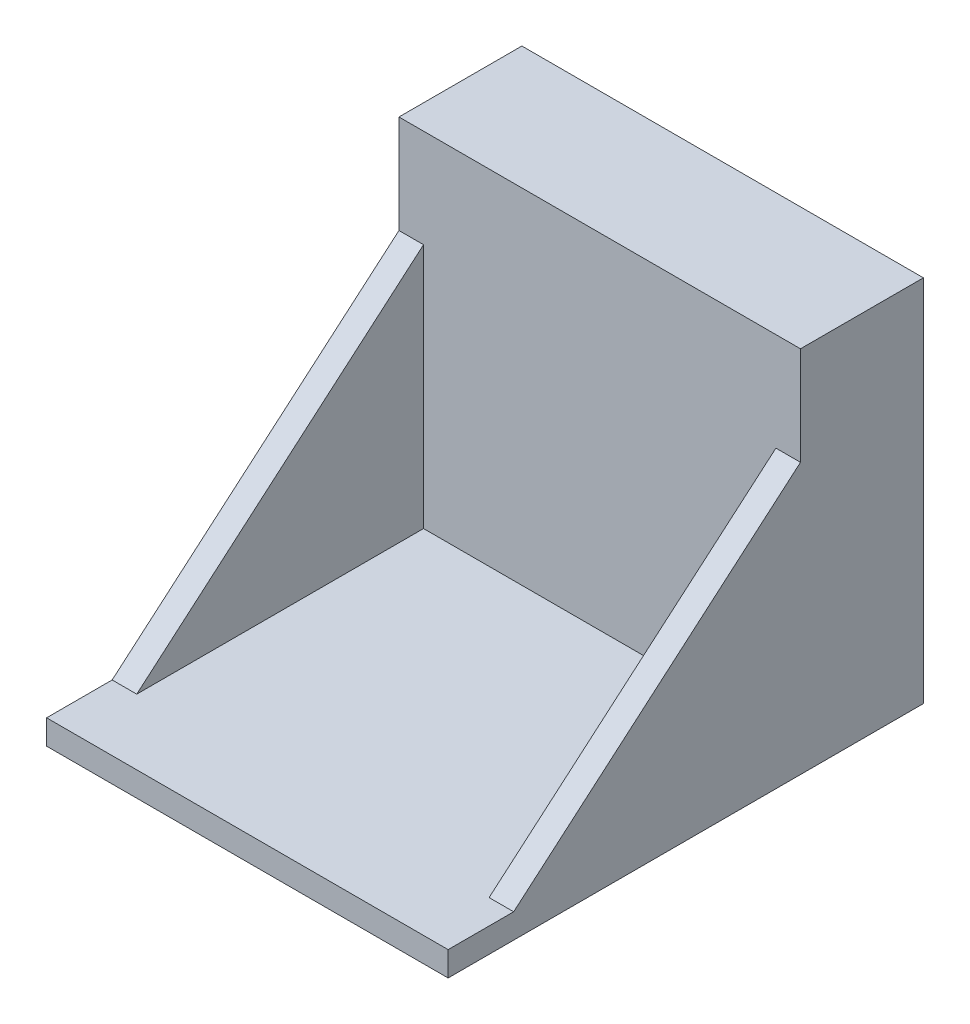
ISO-10303-21;
HEADER;
FILE_DESCRIPTION(('STEP AP214'),'2;1');
FILE_NAME('part.step','',(''),(''),'','','');
FILE_SCHEMA(('AUTOMOTIVE_DESIGN { 1 0 10303 214 1 1 1 1 }'));
ENDSEC;
DATA;
#1=APPLICATION_CONTEXT('core data for automotive mechanical design processes');
#2=APPLICATION_PROTOCOL_DEFINITION('international standard','automotive_design',2000,#1);
#3=PRODUCT_CONTEXT('',#1,'mechanical');
#4=PRODUCT('Part','Part','',(#3));
#5=PRODUCT_RELATED_PRODUCT_CATEGORY('part','',(#4));
#6=PRODUCT_DEFINITION_FORMATION('','',#4);
#7=PRODUCT_DEFINITION_CONTEXT('part definition',#1,'design');
#8=PRODUCT_DEFINITION('design','',#6,#7);
#9=PRODUCT_DEFINITION_SHAPE('','',#8);
#10=(LENGTH_UNIT() NAMED_UNIT(*) SI_UNIT(.MILLI.,.METRE.));
#11=(NAMED_UNIT(*) PLANE_ANGLE_UNIT() SI_UNIT($,.RADIAN.));
#12=(NAMED_UNIT(*) SI_UNIT($,.STERADIAN.) SOLID_ANGLE_UNIT());
#13=UNCERTAINTY_MEASURE_WITH_UNIT(LENGTH_MEASURE(1.E-05),#10,'distance_accuracy_value','');
#14=(GEOMETRIC_REPRESENTATION_CONTEXT(3) GLOBAL_UNCERTAINTY_ASSIGNED_CONTEXT((#13)) GLOBAL_UNIT_ASSIGNED_CONTEXT((#10,
#11,#12)) REPRESENTATION_CONTEXT('',''));
#15=CARTESIAN_POINT('',(0.,0.,0.));
#16=DIRECTION('',(0.,0.,1.));
#17=DIRECTION('',(1.,0.,0.));
#18=AXIS2_PLACEMENT_3D('',#15,#16,#17);
#19=CARTESIAN_POINT('',(-26.9021739130435,22.866847826087,15.));
#20=DIRECTION('',(1.,0.,0.));
#21=DIRECTION('',(0.,1.,0.));
#22=AXIS2_PLACEMENT_3D('',#19,#20,#21);
#23=PLANE('',#22);
#24=DIRECTION('',(0.,-1.,0.));
#25=VECTOR('',#24,1.);
#26=CARTESIAN_POINT('',(-26.9021739130435,22.866847826087,0.));
#27=LINE('',#26,#25);
#28=CARTESIAN_POINT('',(-26.9021739130435,22.866847826087,0.));
#29=VERTEX_POINT('',#28);
#30=CARTESIAN_POINT('',(-26.9021739130435,-22.133152173913,0.));
#31=VERTEX_POINT('',#30);
#32=EDGE_CURVE('E153',#29,#31,#27,.T.);
#33=ORIENTED_EDGE('',*,*,#32,.T.);
#34=DIRECTION('',(0.,0.,-1.));
#35=VECTOR('',#34,1.);
#36=CARTESIAN_POINT('',(-26.9021739130435,-22.133152173913,15.));
#37=LINE('',#36,#35);
#38=CARTESIAN_POINT('',(-26.9021739130435,-22.133152173913,58.));
#39=VERTEX_POINT('',#38);
#40=EDGE_CURVE('E11',#39,#31,#37,.T.);
#41=ORIENTED_EDGE('',*,*,#40,.F.);
#42=DIRECTION('',(0.,-1.,0.));
#43=VECTOR('',#42,1.);
#44=CARTESIAN_POINT('',(-26.9021739130435,-22.133152173913,58.));
#45=LINE('',#44,#43);
#46=CARTESIAN_POINT('',(-26.9021739130435,-19.133152173913,58.));
#47=VERTEX_POINT('',#46);
#48=EDGE_CURVE('E138',#47,#39,#45,.T.);
#49=ORIENTED_EDGE('',*,*,#48,.F.);
#50=DIRECTION('',(0.,0.,-1.));
#51=VECTOR('',#50,1.);
#52=CARTESIAN_POINT('',(-26.9021739130435,-19.133152173913,58.));
#53=LINE('',#52,#51);
#54=CARTESIAN_POINT('',(-26.9021739130435,-19.133152173913,50.));
#55=VERTEX_POINT('',#54);
#56=EDGE_CURVE('E148',#47,#55,#53,.T.);
#57=ORIENTED_EDGE('',*,*,#56,.T.);
#58=DIRECTION('',(0.,0.650791373455968,-0.759256602365297));
#59=VECTOR('',#58,1.);
#60=CARTESIAN_POINT('',(-26.9021739130435,10.866847826087,15.));
#61=LINE('',#60,#59);
#62=CARTESIAN_POINT('',(-26.9021739130435,10.866847826087,15.));
#63=VERTEX_POINT('',#62);
#64=EDGE_CURVE('E113',#55,#63,#61,.T.);
#65=ORIENTED_EDGE('',*,*,#64,.T.);
#66=DIRECTION('',(0.,-1.,0.));
#67=VECTOR('',#66,1.);
#68=CARTESIAN_POINT('',(-26.9021739130435,22.866847826087,15.));
#69=LINE('',#68,#67);
#70=CARTESIAN_POINT('',(-26.9021739130435,22.866847826087,15.));
#71=VERTEX_POINT('',#70);
#72=EDGE_CURVE('E154',#71,#63,#69,.T.);
#73=ORIENTED_EDGE('',*,*,#72,.F.);
#74=DIRECTION('',(0.,0.,-1.));
#75=VECTOR('',#74,1.);
#76=CARTESIAN_POINT('',(-26.9021739130435,22.866847826087,15.));
#77=LINE('',#76,#75);
#78=EDGE_CURVE('E162',#71,#29,#77,.T.);
#79=ORIENTED_EDGE('',*,*,#78,.T.);
#80=EDGE_LOOP('',(#33,#41,#49,#57,#65,#73,#79));
#81=FACE_BOUND('',#80,.T.);
#82=ADVANCED_FACE('F33',(#81),#23,.F.);
#83=CARTESIAN_POINT('',(-26.9021739130435,-22.133152173913,15.));
#84=DIRECTION('',(0.,1.,0.));
#85=DIRECTION('',(0.,0.,1.));
#86=AXIS2_PLACEMENT_3D('',#83,#84,#85);
#87=PLANE('',#86);
#88=DIRECTION('',(1.,0.,0.));
#89=VECTOR('',#88,1.);
#90=CARTESIAN_POINT('',(-26.9021739130435,-22.133152173913,0.));
#91=LINE('',#90,#89);
#92=CARTESIAN_POINT('',(22.0978260869565,-22.133152173913,0.));
#93=VERTEX_POINT('',#92);
#94=EDGE_CURVE('E165',#31,#93,#91,.T.);
#95=ORIENTED_EDGE('',*,*,#94,.T.);
#96=DIRECTION('',(0.,0.,-1.));
#97=VECTOR('',#96,1.);
#98=CARTESIAN_POINT('',(22.0978260869565,-22.133152173913,15.));
#99=LINE('',#98,#97);
#100=CARTESIAN_POINT('',(22.0978260869565,-22.133152173913,58.));
#101=VERTEX_POINT('',#100);
#102=EDGE_CURVE('E40',#101,#93,#99,.T.);
#103=ORIENTED_EDGE('',*,*,#102,.F.);
#104=DIRECTION('',(1.,0.,0.));
#105=VECTOR('',#104,1.);
#106=CARTESIAN_POINT('',(-26.9021739130435,-22.133152173913,58.));
#107=LINE('',#106,#105);
#108=EDGE_CURVE('E141',#39,#101,#107,.T.);
#109=ORIENTED_EDGE('',*,*,#108,.F.);
#110=ORIENTED_EDGE('',*,*,#40,.T.);
#111=EDGE_LOOP('',(#95,#103,#109,#110));
#112=FACE_BOUND('',#111,.T.);
#113=ADVANCED_FACE('F215',(#112),#87,.F.);
#114=CARTESIAN_POINT('',(22.0978260869565,22.866847826087,15.));
#115=DIRECTION('',(-1.,0.,0.));
#116=DIRECTION('',(0.,-1.,0.));
#117=AXIS2_PLACEMENT_3D('',#114,#115,#116);
#118=PLANE('',#117);
#119=DIRECTION('',(0.,1.,0.));
#120=VECTOR('',#119,1.);
#121=CARTESIAN_POINT('',(22.0978260869565,22.866847826087,15.));
#122=LINE('',#121,#120);
#123=CARTESIAN_POINT('',(22.0978260869565,10.866847826087,15.));
#124=VERTEX_POINT('',#123);
#125=CARTESIAN_POINT('',(22.0978260869565,22.866847826087,15.));
#126=VERTEX_POINT('',#125);
#127=EDGE_CURVE('E157',#124,#126,#122,.T.);
#128=ORIENTED_EDGE('',*,*,#127,.F.);
#129=DIRECTION('',(0.,-0.650791373455968,0.759256602365297));
#130=VECTOR('',#129,1.);
#131=CARTESIAN_POINT('',(22.0978260869565,10.866847826087,15.));
#132=LINE('',#131,#130);
#133=CARTESIAN_POINT('',(22.0978260869565,-19.133152173913,50.));
#134=VERTEX_POINT('',#133);
#135=EDGE_CURVE('E196',#124,#134,#132,.T.);
#136=ORIENTED_EDGE('',*,*,#135,.T.);
#137=DIRECTION('',(0.,0.,-1.));
#138=VECTOR('',#137,1.);
#139=CARTESIAN_POINT('',(22.0978260869565,-19.133152173913,58.));
#140=LINE('',#139,#138);
#141=CARTESIAN_POINT('',(22.0978260869565,-19.133152173913,58.));
#142=VERTEX_POINT('',#141);
#143=EDGE_CURVE('E151',#142,#134,#140,.T.);
#144=ORIENTED_EDGE('',*,*,#143,.F.);
#145=DIRECTION('',(0.,1.,0.));
#146=VECTOR('',#145,1.);
#147=CARTESIAN_POINT('',(22.0978260869565,-22.133152173913,58.));
#148=LINE('',#147,#146);
#149=EDGE_CURVE('E144',#101,#142,#148,.T.);
#150=ORIENTED_EDGE('',*,*,#149,.F.);
#151=ORIENTED_EDGE('',*,*,#102,.T.);
#152=DIRECTION('',(0.,1.,0.));
#153=VECTOR('',#152,1.);
#154=CARTESIAN_POINT('',(22.0978260869565,22.866847826087,0.));
#155=LINE('',#154,#153);
#156=CARTESIAN_POINT('',(22.0978260869565,22.866847826087,0.));
#157=VERTEX_POINT('',#156);
#158=EDGE_CURVE('E167',#93,#157,#155,.T.);
#159=ORIENTED_EDGE('',*,*,#158,.T.);
#160=DIRECTION('',(0.,0.,-1.));
#161=VECTOR('',#160,1.);
#162=CARTESIAN_POINT('',(22.0978260869565,22.866847826087,15.));
#163=LINE('',#162,#161);
#164=EDGE_CURVE('E172',#126,#157,#163,.T.);
#165=ORIENTED_EDGE('',*,*,#164,.F.);
#166=EDGE_LOOP('',(#128,#136,#144,#150,#151,#159,#165));
#167=FACE_BOUND('',#166,.T.);
#168=ADVANCED_FACE('F178',(#167),#118,.F.);
#169=CARTESIAN_POINT('',(-26.9021739130435,22.866847826087,15.));
#170=DIRECTION('',(0.,-1.,0.));
#171=DIRECTION('',(0.,0.,-1.));
#172=AXIS2_PLACEMENT_3D('',#169,#170,#171);
#173=PLANE('',#172);
#174=DIRECTION('',(-1.,0.,0.));
#175=VECTOR('',#174,1.);
#176=CARTESIAN_POINT('',(-26.9021739130435,22.866847826087,0.));
#177=LINE('',#176,#175);
#178=EDGE_CURVE('E158',#157,#29,#177,.T.);
#179=ORIENTED_EDGE('',*,*,#178,.T.);
#180=ORIENTED_EDGE('',*,*,#78,.F.);
#181=DIRECTION('',(-1.,0.,0.));
#182=VECTOR('',#181,1.);
#183=CARTESIAN_POINT('',(-26.9021739130435,22.866847826087,15.));
#184=LINE('',#183,#182);
#185=EDGE_CURVE('E160',#126,#71,#184,.T.);
#186=ORIENTED_EDGE('',*,*,#185,.F.);
#187=ORIENTED_EDGE('',*,*,#164,.T.);
#188=EDGE_LOOP('',(#179,#180,#186,#187));
#189=FACE_BOUND('',#188,.T.);
#190=ADVANCED_FACE('F189',(#189),#173,.F.);
#191=CARTESIAN_POINT('',(0.,0.,15.));
#192=DIRECTION('',(0.,0.,1.));
#193=DIRECTION('',(1.,0.,0.));
#194=AXIS2_PLACEMENT_3D('',#191,#192,#193);
#195=PLANE('',#194);
#196=DIRECTION('',(1.,0.,0.));
#197=VECTOR('',#196,1.);
#198=CARTESIAN_POINT('',(19.0978260869565,10.866847826087,15.));
#199=LINE('',#198,#197);
#200=CARTESIAN_POINT('',(19.0978260869565,10.866847826087,15.));
#201=VERTEX_POINT('',#200);
#202=EDGE_CURVE('E51',#201,#124,#199,.T.);
#203=ORIENTED_EDGE('',*,*,#202,.T.);
#204=ORIENTED_EDGE('',*,*,#127,.T.);
#205=ORIENTED_EDGE('',*,*,#185,.T.);
#206=ORIENTED_EDGE('',*,*,#72,.T.);
#207=DIRECTION('',(-1.,0.,0.));
#208=VECTOR('',#207,1.);
#209=CARTESIAN_POINT('',(-23.9021739130435,10.866847826087,15.));
#210=LINE('',#209,#208);
#211=CARTESIAN_POINT('',(-23.9021739130435,10.866847826087,15.));
#212=VERTEX_POINT('',#211);
#213=EDGE_CURVE('E118',#212,#63,#210,.T.);
#214=ORIENTED_EDGE('',*,*,#213,.F.);
#215=DIRECTION('',(0.,-1.,0.));
#216=VECTOR('',#215,1.);
#217=CARTESIAN_POINT('',(-23.9021739130435,-19.133152173913,15.));
#218=LINE('',#217,#216);
#219=CARTESIAN_POINT('',(-23.9021739130435,-19.133152173913,15.));
#220=VERTEX_POINT('',#219);
#221=EDGE_CURVE('E119',#212,#220,#218,.T.);
#222=ORIENTED_EDGE('',*,*,#221,.T.);
#223=DIRECTION('',(-1.,0.,0.));
#224=VECTOR('',#223,1.);
#225=CARTESIAN_POINT('',(-26.9021739130435,-19.133152173913,15.));
#226=LINE('',#225,#224);
#227=CARTESIAN_POINT('',(19.0978260869565,-19.133152173913,15.));
#228=VERTEX_POINT('',#227);
#229=EDGE_CURVE('E129',#228,#220,#226,.T.);
#230=ORIENTED_EDGE('',*,*,#229,.F.);
#231=DIRECTION('',(0.,1.,0.));
#232=VECTOR('',#231,1.);
#233=CARTESIAN_POINT('',(19.0978260869565,-19.133152173913,15.));
#234=LINE('',#233,#232);
#235=EDGE_CURVE('E47',#228,#201,#234,.T.);
#236=ORIENTED_EDGE('',*,*,#235,.T.);
#237=EDGE_LOOP('',(#203,#204,#205,#206,#214,#222,#230,#236));
#238=FACE_BOUND('',#237,.T.);
#239=ADVANCED_FACE('F193',(#238),#195,.T.);
#240=CARTESIAN_POINT('',(0.,0.,0.));
#241=DIRECTION('',(0.,0.,1.));
#242=DIRECTION('',(1.,0.,0.));
#243=AXIS2_PLACEMENT_3D('',#240,#241,#242);
#244=PLANE('',#243);
#245=ORIENTED_EDGE('',*,*,#32,.F.);
#246=ORIENTED_EDGE('',*,*,#178,.F.);
#247=ORIENTED_EDGE('',*,*,#158,.F.);
#248=ORIENTED_EDGE('',*,*,#94,.F.);
#249=EDGE_LOOP('',(#245,#246,#247,#248));
#250=FACE_BOUND('',#249,.T.);
#251=ADVANCED_FACE('F186',(#250),#244,.F.);
#252=CARTESIAN_POINT('',(-26.9021739130435,-19.133152173913,58.));
#253=DIRECTION('',(0.,-1.,0.));
#254=DIRECTION('',(0.,0.,-1.));
#255=AXIS2_PLACEMENT_3D('',#252,#253,#254);
#256=PLANE('',#255);
#257=ORIENTED_EDGE('',*,*,#143,.T.);
#258=DIRECTION('',(1.,0.,0.));
#259=VECTOR('',#258,1.);
#260=CARTESIAN_POINT('',(19.0978260869565,-19.133152173913,50.));
#261=LINE('',#260,#259);
#262=CARTESIAN_POINT('',(19.0978260869565,-19.133152173913,50.));
#263=VERTEX_POINT('',#262);
#264=EDGE_CURVE('E131',#263,#134,#261,.T.);
#265=ORIENTED_EDGE('',*,*,#264,.F.);
#266=DIRECTION('',(0.,0.,-1.));
#267=VECTOR('',#266,1.);
#268=CARTESIAN_POINT('',(19.0978260869565,-19.133152173913,50.));
#269=LINE('',#268,#267);
#270=EDGE_CURVE('E202',#263,#228,#269,.T.);
#271=ORIENTED_EDGE('',*,*,#270,.T.);
#272=ORIENTED_EDGE('',*,*,#229,.T.);
#273=DIRECTION('',(0.,0.,1.));
#274=VECTOR('',#273,1.);
#275=CARTESIAN_POINT('',(-23.9021739130435,-19.133152173913,50.));
#276=LINE('',#275,#274);
#277=CARTESIAN_POINT('',(-23.9021739130435,-19.133152173913,50.));
#278=VERTEX_POINT('',#277);
#279=EDGE_CURVE('E124',#220,#278,#276,.T.);
#280=ORIENTED_EDGE('',*,*,#279,.T.);
#281=DIRECTION('',(-1.,0.,0.));
#282=VECTOR('',#281,1.);
#283=CARTESIAN_POINT('',(-23.9021739130435,-19.133152173913,50.));
#284=LINE('',#283,#282);
#285=EDGE_CURVE('E107',#278,#55,#284,.T.);
#286=ORIENTED_EDGE('',*,*,#285,.T.);
#287=ORIENTED_EDGE('',*,*,#56,.F.);
#288=DIRECTION('',(-1.,0.,0.));
#289=VECTOR('',#288,1.);
#290=CARTESIAN_POINT('',(-26.9021739130435,-19.133152173913,58.));
#291=LINE('',#290,#289);
#292=EDGE_CURVE('E146',#142,#47,#291,.T.);
#293=ORIENTED_EDGE('',*,*,#292,.F.);
#294=EDGE_LOOP('',(#257,#265,#271,#272,#280,#286,#287,#293));
#295=FACE_BOUND('',#294,.T.);
#296=ADVANCED_FACE('F128',(#295),#256,.F.);
#297=CARTESIAN_POINT('',(0.,0.,58.));
#298=DIRECTION('',(0.,0.,-1.));
#299=DIRECTION('',(-1.,0.,0.));
#300=AXIS2_PLACEMENT_3D('',#297,#298,#299);
#301=PLANE('',#300);
#302=ORIENTED_EDGE('',*,*,#48,.T.);
#303=ORIENTED_EDGE('',*,*,#108,.T.);
#304=ORIENTED_EDGE('',*,*,#149,.T.);
#305=ORIENTED_EDGE('',*,*,#292,.T.);
#306=EDGE_LOOP('',(#302,#303,#304,#305));
#307=FACE_BOUND('',#306,.T.);
#308=ADVANCED_FACE('F214',(#307),#301,.F.);
#309=CARTESIAN_POINT('',(-23.9021739130435,10.866847826087,15.));
#310=DIRECTION('',(0.,0.759256602365297,0.650791373455968));
#311=DIRECTION('',(0.,-0.650791373455968,0.759256602365297));
#312=AXIS2_PLACEMENT_3D('',#309,#310,#311);
#313=PLANE('',#312);
#314=ORIENTED_EDGE('',*,*,#64,.F.);
#315=ORIENTED_EDGE('',*,*,#285,.F.);
#316=DIRECTION('',(0.,0.650791373455968,-0.759256602365297));
#317=VECTOR('',#316,1.);
#318=CARTESIAN_POINT('',(-23.9021739130435,10.866847826087,15.));
#319=LINE('',#318,#317);
#320=EDGE_CURVE('E110',#278,#212,#319,.T.);
#321=ORIENTED_EDGE('',*,*,#320,.T.);
#322=ORIENTED_EDGE('',*,*,#213,.T.);
#323=EDGE_LOOP('',(#314,#315,#321,#322));
#324=FACE_BOUND('',#323,.T.);
#325=ADVANCED_FACE('F109',(#324),#313,.T.);
#326=CARTESIAN_POINT('',(-23.9021739130435,0.,0.));
#327=DIRECTION('',(1.,0.,0.));
#328=DIRECTION('',(0.,1.,0.));
#329=AXIS2_PLACEMENT_3D('',#326,#327,#328);
#330=PLANE('',#329);
#331=ORIENTED_EDGE('',*,*,#279,.F.);
#332=ORIENTED_EDGE('',*,*,#221,.F.);
#333=ORIENTED_EDGE('',*,*,#320,.F.);
#334=EDGE_LOOP('',(#331,#332,#333));
#335=FACE_BOUND('',#334,.T.);
#336=ADVANCED_FACE('F123',(#335),#330,.T.);
#337=CARTESIAN_POINT('',(19.0978260869565,10.866847826087,15.));
#338=DIRECTION('',(0.,0.759256602365297,0.650791373455968));
#339=DIRECTION('',(0.,-0.650791373455968,0.759256602365297));
#340=AXIS2_PLACEMENT_3D('',#337,#338,#339);
#341=PLANE('',#340);
#342=ORIENTED_EDGE('',*,*,#135,.F.);
#343=ORIENTED_EDGE('',*,*,#202,.F.);
#344=DIRECTION('',(0.,-0.650791373455968,0.759256602365297));
#345=VECTOR('',#344,1.);
#346=CARTESIAN_POINT('',(19.0978260869565,10.866847826087,15.));
#347=LINE('',#346,#345);
#348=EDGE_CURVE('E206',#201,#263,#347,.T.);
#349=ORIENTED_EDGE('',*,*,#348,.T.);
#350=ORIENTED_EDGE('',*,*,#264,.T.);
#351=EDGE_LOOP('',(#342,#343,#349,#350));
#352=FACE_BOUND('',#351,.T.);
#353=ADVANCED_FACE('F199',(#352),#341,.T.);
#354=CARTESIAN_POINT('',(19.0978260869565,0.,0.));
#355=DIRECTION('',(1.,0.,0.));
#356=DIRECTION('',(0.,1.,0.));
#357=AXIS2_PLACEMENT_3D('',#354,#355,#356);
#358=PLANE('',#357);
#359=ORIENTED_EDGE('',*,*,#270,.F.);
#360=ORIENTED_EDGE('',*,*,#348,.F.);
#361=ORIENTED_EDGE('',*,*,#235,.F.);
#362=EDGE_LOOP('',(#359,#360,#361));
#363=FACE_BOUND('',#362,.T.);
#364=ADVANCED_FACE('F210',(#363),#358,.F.);
#365=CLOSED_SHELL('',(#82,#113,#168,#190,#239,#251,#296,#308,#325,#336,#353,#364));
#366=MANIFOLD_SOLID_BREP('B2',#365);
#367=ADVANCED_BREP_SHAPE_REPRESENTATION('',(#18,#366),#14);
#368=SHAPE_DEFINITION_REPRESENTATION(#9,#367);
ENDSEC;
END-ISO-10303-21;
